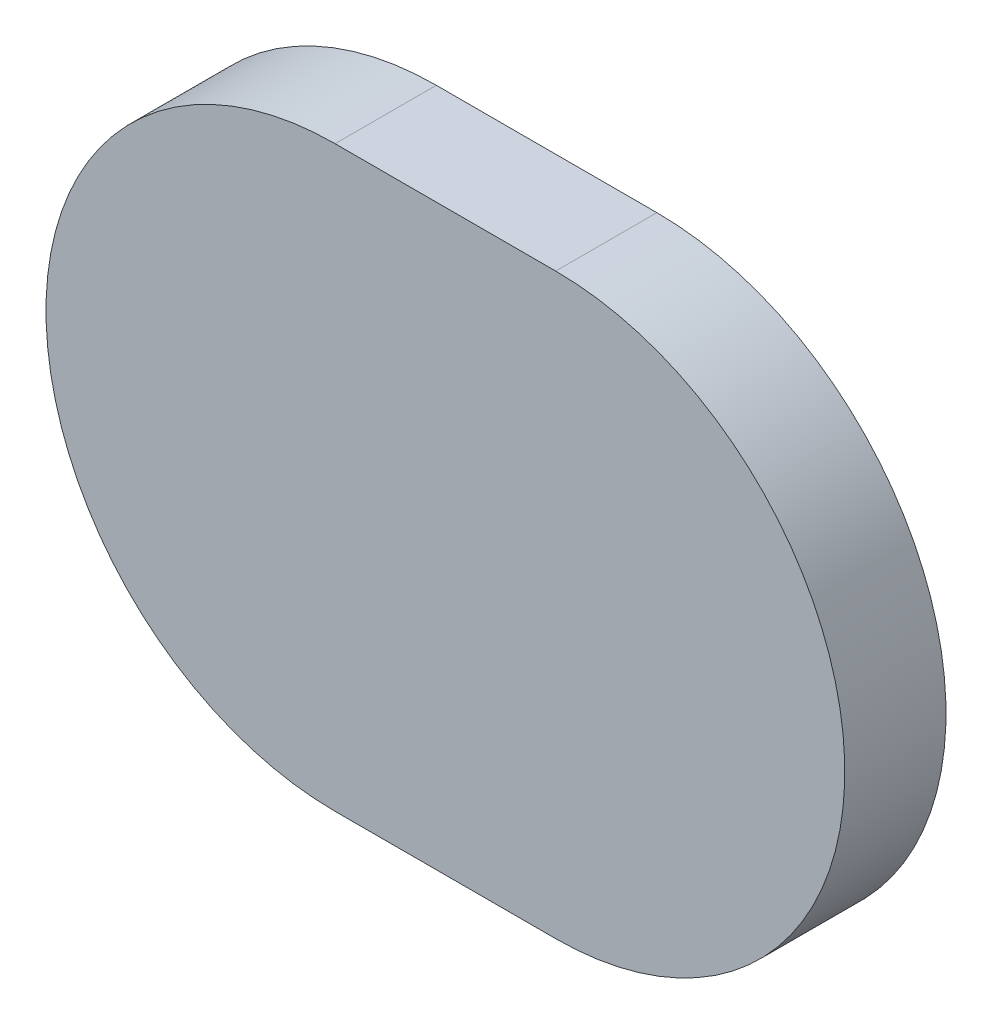
ISO-10303-21;
HEADER;
FILE_DESCRIPTION(('STEP AP214'),'2;1');
FILE_NAME('part.step','',(''),(''),'','','');
FILE_SCHEMA(('AUTOMOTIVE_DESIGN { 1 0 10303 214 1 1 1 1 }'));
ENDSEC;
DATA;
#1=APPLICATION_CONTEXT('core data for automotive mechanical design processes');
#2=APPLICATION_PROTOCOL_DEFINITION('international standard','automotive_design',2000,#1);
#3=PRODUCT_CONTEXT('',#1,'mechanical');
#4=PRODUCT('Part','Part','',(#3));
#5=PRODUCT_RELATED_PRODUCT_CATEGORY('part','',(#4));
#6=PRODUCT_DEFINITION_FORMATION('','',#4);
#7=PRODUCT_DEFINITION_CONTEXT('part definition',#1,'design');
#8=PRODUCT_DEFINITION('design','',#6,#7);
#9=PRODUCT_DEFINITION_SHAPE('','',#8);
#10=(LENGTH_UNIT() NAMED_UNIT(*) SI_UNIT(.MILLI.,.METRE.));
#11=(NAMED_UNIT(*) PLANE_ANGLE_UNIT() SI_UNIT($,.RADIAN.));
#12=(NAMED_UNIT(*) SI_UNIT($,.STERADIAN.) SOLID_ANGLE_UNIT());
#13=UNCERTAINTY_MEASURE_WITH_UNIT(LENGTH_MEASURE(1.E-05),#10,'distance_accuracy_value','');
#14=(GEOMETRIC_REPRESENTATION_CONTEXT(3) GLOBAL_UNCERTAINTY_ASSIGNED_CONTEXT((#13)) GLOBAL_UNIT_ASSIGNED_CONTEXT((#10,
#11,#12)) REPRESENTATION_CONTEXT('',''));
#15=CARTESIAN_POINT('',(0.,0.,0.));
#16=DIRECTION('',(0.,0.,1.));
#17=DIRECTION('',(1.,0.,0.));
#18=AXIS2_PLACEMENT_3D('',#15,#16,#17);
#19=CARTESIAN_POINT('',(95.900589,-125.350589,1.635));
#20=DIRECTION('',(0.,0.,1.));
#21=DIRECTION('',(1.,0.,0.));
#22=AXIS2_PLACEMENT_3D('',#19,#20,#21);
#23=PLANE('',#22);
#24=DIRECTION('',(-1.,0.,0.));
#25=VECTOR('',#24,1.);
#26=CARTESIAN_POINT('',(95.900589,-125.350589,1.635));
#27=LINE('',#26,#25);
#28=CARTESIAN_POINT('',(95.900589,-125.350589,1.635));
#29=VERTEX_POINT('',#28);
#30=CARTESIAN_POINT('',(95.824284,-125.350589,1.635));
#31=VERTEX_POINT('',#30);
#32=EDGE_CURVE('E93',#29,#31,#27,.T.);
#33=ORIENTED_EDGE('',*,*,#32,.T.);
#34=CARTESIAN_POINT('',(95.824284,-125.450589,1.635));
#35=DIRECTION('',(0.,0.,1.));
#36=DIRECTION('',(1.42108547152E-13,1.,0.));
#37=AXIS2_PLACEMENT_3D('',#34,#35,#36);
#38=CIRCLE('',#37,0.1);
#39=CARTESIAN_POINT('',(95.824284,-125.550589,1.635));
#40=VERTEX_POINT('',#39);
#41=EDGE_CURVE('E71',#31,#40,#38,.T.);
#42=ORIENTED_EDGE('',*,*,#41,.T.);
#43=DIRECTION('',(1.,0.,0.));
#44=VECTOR('',#43,1.);
#45=CARTESIAN_POINT('',(95.824284,-125.550589,1.635));
#46=LINE('',#45,#44);
#47=CARTESIAN_POINT('',(95.900589,-125.550589,1.635));
#48=VERTEX_POINT('',#47);
#49=EDGE_CURVE('E76',#40,#48,#46,.T.);
#50=ORIENTED_EDGE('',*,*,#49,.T.);
#51=CARTESIAN_POINT('',(95.900589,-125.450589,1.635));
#52=DIRECTION('',(0.,0.,1.));
#53=DIRECTION('',(-1.42108547152E-13,-1.,0.));
#54=AXIS2_PLACEMENT_3D('',#51,#52,#53);
#55=CIRCLE('',#54,0.1);
#56=EDGE_CURVE('E11',#48,#29,#55,.T.);
#57=ORIENTED_EDGE('',*,*,#56,.T.);
#58=EDGE_LOOP('',(#33,#42,#50,#57));
#59=FACE_BOUND('',#58,.T.);
#60=ADVANCED_FACE('F17',(#59),#23,.T.);
#61=CARTESIAN_POINT('',(95.900589,-125.350589,1.6));
#62=DIRECTION('',(0.,0.,1.));
#63=DIRECTION('',(1.,0.,0.));
#64=AXIS2_PLACEMENT_3D('',#61,#62,#63);
#65=PLANE('',#64);
#66=CARTESIAN_POINT('',(95.900589,-125.450589,1.6));
#67=DIRECTION('',(0.,0.,1.));
#68=DIRECTION('',(-1.42108547152E-13,-1.,0.));
#69=AXIS2_PLACEMENT_3D('',#66,#67,#68);
#70=CIRCLE('',#69,0.1);
#71=CARTESIAN_POINT('',(95.900589,-125.550589,1.6));
#72=VERTEX_POINT('',#71);
#73=CARTESIAN_POINT('',(95.900589,-125.350589,1.6));
#74=VERTEX_POINT('',#73);
#75=EDGE_CURVE('E25',#72,#74,#70,.T.);
#76=ORIENTED_EDGE('',*,*,#75,.F.);
#77=DIRECTION('',(1.,0.,0.));
#78=VECTOR('',#77,1.);
#79=CARTESIAN_POINT('',(95.824284,-125.550589,1.6));
#80=LINE('',#79,#78);
#81=CARTESIAN_POINT('',(95.824284,-125.550589,1.6));
#82=VERTEX_POINT('',#81);
#83=EDGE_CURVE('E60',#82,#72,#80,.T.);
#84=ORIENTED_EDGE('',*,*,#83,.F.);
#85=CARTESIAN_POINT('',(95.824284,-125.450589,1.6));
#86=DIRECTION('',(0.,0.,1.));
#87=DIRECTION('',(1.42108547152E-13,1.,0.));
#88=AXIS2_PLACEMENT_3D('',#85,#86,#87);
#89=CIRCLE('',#88,0.1);
#90=CARTESIAN_POINT('',(95.824284,-125.350589,1.6));
#91=VERTEX_POINT('',#90);
#92=EDGE_CURVE('E65',#91,#82,#89,.T.);
#93=ORIENTED_EDGE('',*,*,#92,.F.);
#94=DIRECTION('',(-1.,0.,0.));
#95=VECTOR('',#94,1.);
#96=CARTESIAN_POINT('',(95.900589,-125.350589,1.6));
#97=LINE('',#96,#95);
#98=EDGE_CURVE('E115',#74,#91,#97,.T.);
#99=ORIENTED_EDGE('',*,*,#98,.F.);
#100=EDGE_LOOP('',(#76,#84,#93,#99));
#101=FACE_BOUND('',#100,.T.);
#102=ADVANCED_FACE('F62',(#101),#65,.F.);
#103=CARTESIAN_POINT('',(95.900589,-125.450589,1.6));
#104=DIRECTION('',(0.,0.,-1.));
#105=DIRECTION('',(-1.42108547152E-13,-1.,0.));
#106=AXIS2_PLACEMENT_3D('',#103,#104,#105);
#107=CYLINDRICAL_SURFACE('',#106,0.1);
#108=ORIENTED_EDGE('',*,*,#75,.T.);
#109=DIRECTION('',(0.,0.,1.));
#110=VECTOR('',#109,1.);
#111=CARTESIAN_POINT('',(95.900589,-125.350589,1.6));
#112=LINE('',#111,#110);
#113=EDGE_CURVE('E87',#74,#29,#112,.T.);
#114=ORIENTED_EDGE('',*,*,#113,.T.);
#115=ORIENTED_EDGE('',*,*,#56,.F.);
#116=DIRECTION('',(0.,0.,1.));
#117=VECTOR('',#116,1.);
#118=CARTESIAN_POINT('',(95.900589,-125.550589,1.6));
#119=LINE('',#118,#117);
#120=EDGE_CURVE('E70',#72,#48,#119,.T.);
#121=ORIENTED_EDGE('',*,*,#120,.F.);
#122=EDGE_LOOP('',(#108,#114,#115,#121));
#123=FACE_BOUND('',#122,.T.);
#124=ADVANCED_FACE('F107',(#123),#107,.T.);
#125=CARTESIAN_POINT('',(95.824284,-125.550589,1.6));
#126=DIRECTION('',(0.,1.,0.));
#127=DIRECTION('',(1.,0.,0.));
#128=AXIS2_PLACEMENT_3D('',#125,#126,#127);
#129=PLANE('',#128);
#130=ORIENTED_EDGE('',*,*,#83,.T.);
#131=ORIENTED_EDGE('',*,*,#120,.T.);
#132=ORIENTED_EDGE('',*,*,#49,.F.);
#133=DIRECTION('',(0.,0.,1.));
#134=VECTOR('',#133,1.);
#135=CARTESIAN_POINT('',(95.824284,-125.550589,1.6));
#136=LINE('',#135,#134);
#137=EDGE_CURVE('E74',#82,#40,#136,.T.);
#138=ORIENTED_EDGE('',*,*,#137,.F.);
#139=EDGE_LOOP('',(#130,#131,#132,#138));
#140=FACE_BOUND('',#139,.T.);
#141=ADVANCED_FACE('F75',(#140),#129,.F.);
#142=CARTESIAN_POINT('',(95.824284,-125.450589,1.6));
#143=DIRECTION('',(0.,0.,-1.));
#144=DIRECTION('',(1.42108547152E-13,1.,0.));
#145=AXIS2_PLACEMENT_3D('',#142,#143,#144);
#146=CYLINDRICAL_SURFACE('',#145,0.1);
#147=ORIENTED_EDGE('',*,*,#92,.T.);
#148=ORIENTED_EDGE('',*,*,#137,.T.);
#149=ORIENTED_EDGE('',*,*,#41,.F.);
#150=DIRECTION('',(0.,0.,1.));
#151=VECTOR('',#150,1.);
#152=CARTESIAN_POINT('',(95.824284,-125.350589,1.6));
#153=LINE('',#152,#151);
#154=EDGE_CURVE('E84',#91,#31,#153,.T.);
#155=ORIENTED_EDGE('',*,*,#154,.F.);
#156=EDGE_LOOP('',(#147,#148,#149,#155));
#157=FACE_BOUND('',#156,.T.);
#158=ADVANCED_FACE('F82',(#157),#146,.T.);
#159=CARTESIAN_POINT('',(95.900589,-125.350589,1.6));
#160=DIRECTION('',(0.,-1.,0.));
#161=DIRECTION('',(0.,0.,-1.));
#162=AXIS2_PLACEMENT_3D('',#159,#160,#161);
#163=PLANE('',#162);
#164=ORIENTED_EDGE('',*,*,#98,.T.);
#165=ORIENTED_EDGE('',*,*,#154,.T.);
#166=ORIENTED_EDGE('',*,*,#32,.F.);
#167=ORIENTED_EDGE('',*,*,#113,.F.);
#168=EDGE_LOOP('',(#164,#165,#166,#167));
#169=FACE_BOUND('',#168,.T.);
#170=ADVANCED_FACE('F114',(#169),#163,.F.);
#171=CLOSED_SHELL('',(#60,#102,#124,#141,#158,#170));
#172=MANIFOLD_SOLID_BREP('B1',#171);
#173=ADVANCED_BREP_SHAPE_REPRESENTATION('',(#18,#172),#14);
#174=SHAPE_DEFINITION_REPRESENTATION(#9,#173);
ENDSEC;
END-ISO-10303-21;
